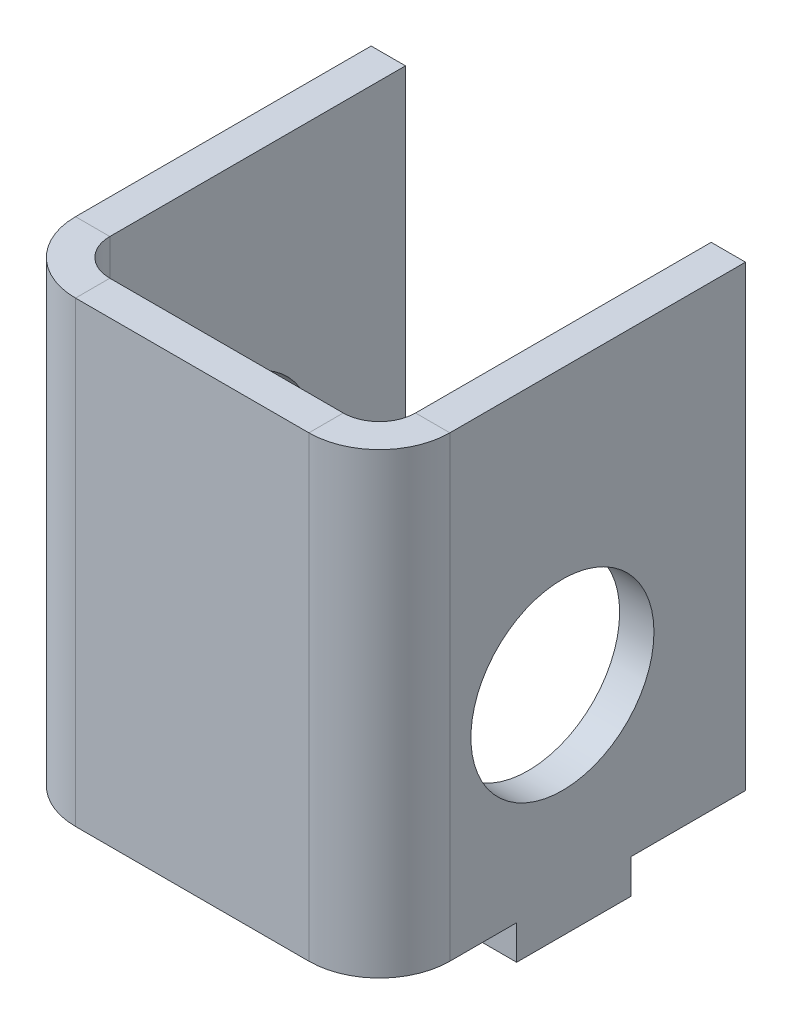
ISO-10303-21;
HEADER;
FILE_DESCRIPTION(('STEP AP214'),'2;1');
FILE_NAME('part.step','',(''),(''),'','','');
FILE_SCHEMA(('AUTOMOTIVE_DESIGN { 1 0 10303 214 1 1 1 1 }'));
ENDSEC;
DATA;
#1=APPLICATION_CONTEXT('core data for automotive mechanical design processes');
#2=APPLICATION_PROTOCOL_DEFINITION('international standard','automotive_design',2000,#1);
#3=PRODUCT_CONTEXT('',#1,'mechanical');
#4=PRODUCT('Part','Part','',(#3));
#5=PRODUCT_RELATED_PRODUCT_CATEGORY('part','',(#4));
#6=PRODUCT_DEFINITION_FORMATION('','',#4);
#7=PRODUCT_DEFINITION_CONTEXT('part definition',#1,'design');
#8=PRODUCT_DEFINITION('design','',#6,#7);
#9=PRODUCT_DEFINITION_SHAPE('','',#8);
#10=(LENGTH_UNIT() NAMED_UNIT(*) SI_UNIT(.MILLI.,.METRE.));
#11=(NAMED_UNIT(*) PLANE_ANGLE_UNIT() SI_UNIT($,.RADIAN.));
#12=(NAMED_UNIT(*) SI_UNIT($,.STERADIAN.) SOLID_ANGLE_UNIT());
#13=UNCERTAINTY_MEASURE_WITH_UNIT(LENGTH_MEASURE(1.E-05),#10,'distance_accuracy_value','');
#14=(GEOMETRIC_REPRESENTATION_CONTEXT(3) GLOBAL_UNCERTAINTY_ASSIGNED_CONTEXT((#13)) GLOBAL_UNIT_ASSIGNED_CONTEXT((#10,
#11,#12)) REPRESENTATION_CONTEXT('',''));
#15=CARTESIAN_POINT('',(0.,0.,0.));
#16=DIRECTION('',(0.,0.,1.));
#17=DIRECTION('',(1.,0.,0.));
#18=AXIS2_PLACEMENT_3D('',#15,#16,#17);
#19=CARTESIAN_POINT('',(449.389499999999,811.2125,16.4084000000001));
#20=DIRECTION('',(0.,-1.,0.));
#21=DIRECTION('',(0.,0.,-1.));
#22=AXIS2_PLACEMENT_3D('',#19,#20,#21);
#23=PLANE('',#22);
#24=DIRECTION('',(0.,0.,1.));
#25=VECTOR('',#24,1.);
#26=CARTESIAN_POINT('',(432.5239,811.2125,1.11022302462516E-13));
#27=LINE('',#26,#25);
#28=CARTESIAN_POINT('',(432.5239,811.2125,12.7000000000001));
#29=VERTEX_POINT('',#28);
#30=CARTESIAN_POINT('',(432.5239,811.2125,16.4084000000001));
#31=VERTEX_POINT('',#30);
#32=EDGE_CURVE('E66',#29,#31,#27,.T.);
#33=ORIENTED_EDGE('',*,*,#32,.F.);
#34=DIRECTION('',(-1.,0.,0.));
#35=VECTOR('',#34,1.);
#36=CARTESIAN_POINT('',(434.4289,811.2125,12.7000000000001));
#37=LINE('',#36,#35);
#38=CARTESIAN_POINT('',(434.4289,811.2125,12.7000000000001));
#39=VERTEX_POINT('',#38);
#40=EDGE_CURVE('E205',#39,#29,#37,.T.);
#41=ORIENTED_EDGE('',*,*,#40,.F.);
#42=DIRECTION('',(0.,0.,1.));
#43=VECTOR('',#42,1.);
#44=CARTESIAN_POINT('',(434.4289,811.2125,1.11022302462516E-13));
#45=LINE('',#44,#43);
#46=CARTESIAN_POINT('',(434.4289,811.2125,16.4084000000001));
#47=VERTEX_POINT('',#46);
#48=EDGE_CURVE('E189',#39,#47,#45,.T.);
#49=ORIENTED_EDGE('',*,*,#48,.T.);
#50=DIRECTION('',(-1.,0.,0.));
#51=VECTOR('',#50,1.);
#52=CARTESIAN_POINT('',(434.4289,811.2125,16.4084000000001));
#53=LINE('',#52,#51);
#54=EDGE_CURVE('E59',#47,#31,#53,.T.);
#55=ORIENTED_EDGE('',*,*,#54,.T.);
#56=EDGE_LOOP('',(#33,#41,#49,#55));
#57=FACE_BOUND('',#56,.T.);
#58=ADVANCED_FACE('F49',(#57),#23,.T.);
#59=CARTESIAN_POINT('',(434.4289,811.2125,1.11022302462516E-13));
#60=VERTEX_POINT('',#59);
#61=CARTESIAN_POINT('',(434.4289,811.2125,6.35000000000011));
#62=VERTEX_POINT('',#61);
#63=EDGE_CURVE('E201',#60,#62,#45,.T.);
#64=ORIENTED_EDGE('',*,*,#63,.T.);
#65=DIRECTION('',(1.,0.,0.));
#66=VECTOR('',#65,1.);
#67=CARTESIAN_POINT('',(434.4289,811.2125,6.35000000000011));
#68=LINE('',#67,#66);
#69=CARTESIAN_POINT('',(432.5239,811.2125,6.35000000000011));
#70=VERTEX_POINT('',#69);
#71=EDGE_CURVE('E74',#70,#62,#68,.T.);
#72=ORIENTED_EDGE('',*,*,#71,.F.);
#73=CARTESIAN_POINT('',(432.5239,811.2125,1.11022302462516E-13));
#74=VERTEX_POINT('',#73);
#75=EDGE_CURVE('E309',#74,#70,#27,.T.);
#76=ORIENTED_EDGE('',*,*,#75,.F.);
#77=DIRECTION('',(-1.,0.,0.));
#78=VECTOR('',#77,1.);
#79=CARTESIAN_POINT('',(434.4289,811.2125,1.11022302462516E-13));
#80=LINE('',#79,#78);
#81=EDGE_CURVE('E202',#60,#74,#80,.T.);
#82=ORIENTED_EDGE('',*,*,#81,.F.);
#83=EDGE_LOOP('',(#64,#72,#76,#82));
#84=FACE_BOUND('',#83,.T.);
#85=ADVANCED_FACE('F638',(#84),#23,.T.);
#86=CARTESIAN_POINT('',(449.389499999999,811.2125,18.4150000000001));
#87=DIRECTION('',(0.,-1.,0.));
#88=DIRECTION('',(0.,0.,-1.));
#89=AXIS2_PLACEMENT_3D('',#86,#87,#88);
#90=PLANE('',#89);
#91=DIRECTION('',(0.,0.,-1.));
#92=VECTOR('',#91,1.);
#93=CARTESIAN_POINT('',(453.301099999999,811.2125,20.3200000000001));
#94=LINE('',#93,#92);
#95=CARTESIAN_POINT('',(453.301099999999,811.2125,6.35000000000011));
#96=VERTEX_POINT('',#95);
#97=CARTESIAN_POINT('',(453.301099999999,811.2125,1.11022302462516E-13));
#98=VERTEX_POINT('',#97);
#99=EDGE_CURVE('E292',#96,#98,#94,.T.);
#100=ORIENTED_EDGE('',*,*,#99,.F.);
#101=DIRECTION('',(1.,0.,0.));
#102=VECTOR('',#101,1.);
#103=CARTESIAN_POINT('',(451.396099999999,811.2125,6.35000000000011));
#104=LINE('',#103,#102);
#105=CARTESIAN_POINT('',(451.396099999999,811.2125,6.35000000000011));
#106=VERTEX_POINT('',#105);
#107=EDGE_CURVE('E209',#106,#96,#104,.T.);
#108=ORIENTED_EDGE('',*,*,#107,.F.);
#109=DIRECTION('',(0.,0.,-1.));
#110=VECTOR('',#109,1.);
#111=CARTESIAN_POINT('',(451.396099999999,811.2125,20.3200000000001));
#112=LINE('',#111,#110);
#113=CARTESIAN_POINT('',(451.396099999999,811.2125,1.11022302462516E-13));
#114=VERTEX_POINT('',#113);
#115=EDGE_CURVE('E288',#106,#114,#112,.T.);
#116=ORIENTED_EDGE('',*,*,#115,.T.);
#117=DIRECTION('',(-1.,0.,0.));
#118=VECTOR('',#117,1.);
#119=CARTESIAN_POINT('',(453.301099999999,811.2125,1.11022302462516E-13));
#120=LINE('',#119,#118);
#121=EDGE_CURVE('E287',#98,#114,#120,.T.);
#122=ORIENTED_EDGE('',*,*,#121,.F.);
#123=EDGE_LOOP('',(#100,#108,#116,#122));
#124=FACE_BOUND('',#123,.T.);
#125=ADVANCED_FACE('F494',(#124),#90,.T.);
#126=CARTESIAN_POINT('',(451.396099999999,811.2125,16.4084000000001));
#127=VERTEX_POINT('',#126);
#128=CARTESIAN_POINT('',(451.396099999999,811.2125,12.7000000000001));
#129=VERTEX_POINT('',#128);
#130=EDGE_CURVE('E283',#127,#129,#112,.T.);
#131=ORIENTED_EDGE('',*,*,#130,.T.);
#132=DIRECTION('',(-1.,0.,0.));
#133=VECTOR('',#132,1.);
#134=CARTESIAN_POINT('',(451.396099999999,811.2125,12.7000000000001));
#135=LINE('',#134,#133);
#136=CARTESIAN_POINT('',(453.301099999999,811.2125,12.7000000000001));
#137=VERTEX_POINT('',#136);
#138=EDGE_CURVE('E243',#137,#129,#135,.T.);
#139=ORIENTED_EDGE('',*,*,#138,.F.);
#140=CARTESIAN_POINT('',(453.301099999999,811.2125,16.4084000000001));
#141=VERTEX_POINT('',#140);
#142=EDGE_CURVE('E293',#141,#137,#94,.T.);
#143=ORIENTED_EDGE('',*,*,#142,.F.);
#144=DIRECTION('',(-1.,0.,0.));
#145=VECTOR('',#144,1.);
#146=CARTESIAN_POINT('',(453.301099999999,811.2125,16.4084000000001));
#147=LINE('',#146,#145);
#148=EDGE_CURVE('E425',#141,#127,#147,.T.);
#149=ORIENTED_EDGE('',*,*,#148,.T.);
#150=EDGE_LOOP('',(#131,#139,#143,#149));
#151=FACE_BOUND('',#150,.T.);
#152=ADVANCED_FACE('F472',(#151),#90,.T.);
#153=CARTESIAN_POINT('',(436.4355,811.2125,20.3200000000001));
#154=DIRECTION('',(0.,-1.,0.));
#155=DIRECTION('',(0.,0.,-1.));
#156=AXIS2_PLACEMENT_3D('',#153,#154,#155);
#157=PLANE('',#156);
#158=DIRECTION('',(0.,0.,-1.));
#159=VECTOR('',#158,1.);
#160=CARTESIAN_POINT('',(436.4355,811.2125,20.3200000000001));
#161=LINE('',#160,#159);
#162=CARTESIAN_POINT('',(436.4355,811.2125,20.3200000000001));
#163=VERTEX_POINT('',#162);
#164=CARTESIAN_POINT('',(436.4355,811.2125,18.4150000000001));
#165=VERTEX_POINT('',#164);
#166=EDGE_CURVE('E11',#163,#165,#161,.T.);
#167=ORIENTED_EDGE('',*,*,#166,.F.);
#168=CARTESIAN_POINT('',(436.4355,811.2125,16.4084000000001));
#169=DIRECTION('',(0.,-1.,0.));
#170=DIRECTION('',(0.,0.,-1.));
#171=AXIS2_PLACEMENT_3D('',#168,#169,#170);
#172=CIRCLE('',#171,3.9116);
#173=EDGE_CURVE('E305',#31,#163,#172,.F.);
#174=ORIENTED_EDGE('',*,*,#173,.F.);
#175=ORIENTED_EDGE('',*,*,#54,.F.);
#176=CARTESIAN_POINT('',(436.4355,811.2125,16.4084000000001));
#177=DIRECTION('',(0.,-1.,0.));
#178=DIRECTION('',(1.,0.,0.));
#179=AXIS2_PLACEMENT_3D('',#176,#177,#178);
#180=CIRCLE('',#179,2.0066);
#181=EDGE_CURVE('E316',#47,#165,#180,.F.);
#182=ORIENTED_EDGE('',*,*,#181,.T.);
#183=EDGE_LOOP('',(#167,#174,#175,#182));
#184=FACE_BOUND('',#183,.T.);
#185=ADVANCED_FACE('F51',(#184),#157,.T.);
#186=CARTESIAN_POINT('',(434.4289,811.2125,16.4084000000001));
#187=DIRECTION('',(0.,-1.,0.));
#188=DIRECTION('',(0.,0.,-1.));
#189=AXIS2_PLACEMENT_3D('',#186,#187,#188);
#190=PLANE('',#189);
#191=DIRECTION('',(1.,0.,0.));
#192=VECTOR('',#191,1.);
#193=CARTESIAN_POINT('',(432.5239,811.2125,20.3200000000001));
#194=LINE('',#193,#192);
#195=CARTESIAN_POINT('',(449.389499999999,811.2125,20.3200000000001));
#196=VERTEX_POINT('',#195);
#197=EDGE_CURVE('E301',#163,#196,#194,.T.);
#198=ORIENTED_EDGE('',*,*,#197,.F.);
#199=ORIENTED_EDGE('',*,*,#166,.T.);
#200=DIRECTION('',(1.,0.,0.));
#201=VECTOR('',#200,1.);
#202=CARTESIAN_POINT('',(432.5239,811.2125,18.4150000000001));
#203=LINE('',#202,#201);
#204=CARTESIAN_POINT('',(449.389499999999,811.2125,18.4150000000001));
#205=VERTEX_POINT('',#204);
#206=EDGE_CURVE('E320',#165,#205,#203,.T.);
#207=ORIENTED_EDGE('',*,*,#206,.T.);
#208=DIRECTION('',(0.,0.,1.));
#209=VECTOR('',#208,1.);
#210=CARTESIAN_POINT('',(449.389499999999,811.2125,18.4150000000001));
#211=LINE('',#210,#209);
#212=EDGE_CURVE('E422',#205,#196,#211,.T.);
#213=ORIENTED_EDGE('',*,*,#212,.T.);
#214=EDGE_LOOP('',(#198,#199,#207,#213));
#215=FACE_BOUND('',#214,.T.);
#216=ADVANCED_FACE('F452',(#215),#190,.T.);
#217=CARTESIAN_POINT('',(432.5239,836.6125,16.4084000000001));
#218=DIRECTION('',(0.,1.,0.));
#219=DIRECTION('',(0.,0.,1.));
#220=AXIS2_PLACEMENT_3D('',#217,#218,#219);
#221=PLANE('',#220);
#222=DIRECTION('',(1.,0.,0.));
#223=VECTOR('',#222,1.);
#224=CARTESIAN_POINT('',(432.5239,836.6125,16.4084000000001));
#225=LINE('',#224,#223);
#226=CARTESIAN_POINT('',(432.5239,836.6125,16.4084000000001));
#227=VERTEX_POINT('',#226);
#228=CARTESIAN_POINT('',(434.4289,836.6125,16.4084000000001));
#229=VERTEX_POINT('',#228);
#230=EDGE_CURVE('E431',#227,#229,#225,.T.);
#231=ORIENTED_EDGE('',*,*,#230,.F.);
#232=CARTESIAN_POINT('',(436.4355,836.6125,16.4084000000001));
#233=DIRECTION('',(0.,-1.,0.));
#234=DIRECTION('',(0.,0.,-1.));
#235=AXIS2_PLACEMENT_3D('',#232,#233,#234);
#236=CIRCLE('',#235,3.9116);
#237=CARTESIAN_POINT('',(436.4355,836.6125,20.3200000000001));
#238=VERTEX_POINT('',#237);
#239=EDGE_CURVE('E348',#227,#238,#236,.F.);
#240=ORIENTED_EDGE('',*,*,#239,.T.);
#241=DIRECTION('',(0.,0.,1.));
#242=VECTOR('',#241,1.);
#243=CARTESIAN_POINT('',(436.4355,836.6125,18.4150000000001));
#244=LINE('',#243,#242);
#245=CARTESIAN_POINT('',(436.4355,836.6125,18.4150000000001));
#246=VERTEX_POINT('',#245);
#247=EDGE_CURVE('E428',#246,#238,#244,.T.);
#248=ORIENTED_EDGE('',*,*,#247,.F.);
#249=CARTESIAN_POINT('',(436.4355,836.6125,16.4084000000001));
#250=DIRECTION('',(0.,-1.,0.));
#251=DIRECTION('',(1.,0.,0.));
#252=AXIS2_PLACEMENT_3D('',#249,#250,#251);
#253=CIRCLE('',#252,2.0066);
#254=EDGE_CURVE('E363',#229,#246,#253,.F.);
#255=ORIENTED_EDGE('',*,*,#254,.F.);
#256=EDGE_LOOP('',(#231,#240,#248,#255));
#257=FACE_BOUND('',#256,.T.);
#258=ADVANCED_FACE('F716',(#257),#221,.T.);
#259=CARTESIAN_POINT('',(436.4355,836.6125,18.4150000000001));
#260=DIRECTION('',(0.,1.,0.));
#261=DIRECTION('',(0.,0.,1.));
#262=AXIS2_PLACEMENT_3D('',#259,#260,#261);
#263=PLANE('',#262);
#264=DIRECTION('',(0.,0.,1.));
#265=VECTOR('',#264,1.);
#266=CARTESIAN_POINT('',(432.5239,836.6125,1.11022302462516E-13));
#267=LINE('',#266,#265);
#268=CARTESIAN_POINT('',(432.5239,836.6125,1.11022302462516E-13));
#269=VERTEX_POINT('',#268);
#270=EDGE_CURVE('E352',#269,#227,#267,.T.);
#271=ORIENTED_EDGE('',*,*,#270,.T.);
#272=ORIENTED_EDGE('',*,*,#230,.T.);
#273=DIRECTION('',(0.,0.,1.));
#274=VECTOR('',#273,1.);
#275=CARTESIAN_POINT('',(434.4289,836.6125,1.11022302462516E-13));
#276=LINE('',#275,#274);
#277=CARTESIAN_POINT('',(434.4289,836.6125,1.11022302462516E-13));
#278=VERTEX_POINT('',#277);
#279=EDGE_CURVE('E360',#278,#229,#276,.T.);
#280=ORIENTED_EDGE('',*,*,#279,.F.);
#281=DIRECTION('',(-1.,0.,0.));
#282=VECTOR('',#281,1.);
#283=CARTESIAN_POINT('',(434.4289,836.6125,1.11022302462516E-13));
#284=LINE('',#283,#282);
#285=EDGE_CURVE('E356',#278,#269,#284,.T.);
#286=ORIENTED_EDGE('',*,*,#285,.T.);
#287=EDGE_LOOP('',(#271,#272,#280,#286));
#288=FACE_BOUND('',#287,.T.);
#289=ADVANCED_FACE('F713',(#288),#263,.T.);
#290=CARTESIAN_POINT('',(453.301099999999,811.2125,16.4084000000001));
#291=DIRECTION('',(0.,-1.,0.));
#292=DIRECTION('',(0.,0.,-1.));
#293=AXIS2_PLACEMENT_3D('',#290,#291,#292);
#294=PLANE('',#293);
#295=ORIENTED_EDGE('',*,*,#148,.F.);
#296=CARTESIAN_POINT('',(449.389499999999,811.2125,16.4084000000001));
#297=DIRECTION('',(0.,-1.,0.));
#298=DIRECTION('',(0.,0.,-1.));
#299=AXIS2_PLACEMENT_3D('',#296,#297,#298);
#300=CIRCLE('',#299,3.9116);
#301=EDGE_CURVE('E297',#196,#141,#300,.F.);
#302=ORIENTED_EDGE('',*,*,#301,.F.);
#303=ORIENTED_EDGE('',*,*,#212,.F.);
#304=CARTESIAN_POINT('',(449.389499999999,811.2125,16.4084000000001));
#305=DIRECTION('',(0.,-1.,0.));
#306=DIRECTION('',(1.,0.,0.));
#307=AXIS2_PLACEMENT_3D('',#304,#305,#306);
#308=CIRCLE('',#307,2.0066);
#309=EDGE_CURVE('E324',#205,#127,#308,.F.);
#310=ORIENTED_EDGE('',*,*,#309,.T.);
#311=EDGE_LOOP('',(#295,#302,#303,#310));
#312=FACE_BOUND('',#311,.T.);
#313=ADVANCED_FACE('F461',(#312),#294,.T.);
#314=CARTESIAN_POINT('',(449.389499999999,836.6125,20.3200000000001));
#315=DIRECTION('',(0.,1.,0.));
#316=DIRECTION('',(0.,0.,1.));
#317=AXIS2_PLACEMENT_3D('',#314,#315,#316);
#318=PLANE('',#317);
#319=DIRECTION('',(0.,0.,-1.));
#320=VECTOR('',#319,1.);
#321=CARTESIAN_POINT('',(449.389499999999,836.6125,20.3200000000001));
#322=LINE('',#321,#320);
#323=CARTESIAN_POINT('',(449.389499999999,836.6125,20.3200000000001));
#324=VERTEX_POINT('',#323);
#325=CARTESIAN_POINT('',(449.389499999999,836.6125,18.4150000000001));
#326=VERTEX_POINT('',#325);
#327=EDGE_CURVE('E419',#324,#326,#322,.T.);
#328=ORIENTED_EDGE('',*,*,#327,.F.);
#329=CARTESIAN_POINT('',(449.389499999999,836.6125,16.4084000000001));
#330=DIRECTION('',(0.,-1.,0.));
#331=DIRECTION('',(0.,0.,-1.));
#332=AXIS2_PLACEMENT_3D('',#329,#330,#331);
#333=CIRCLE('',#332,3.9116);
#334=CARTESIAN_POINT('',(453.301099999999,836.6125,16.4084000000001));
#335=VERTEX_POINT('',#334);
#336=EDGE_CURVE('E340',#324,#335,#333,.F.);
#337=ORIENTED_EDGE('',*,*,#336,.T.);
#338=DIRECTION('',(1.,0.,0.));
#339=VECTOR('',#338,1.);
#340=CARTESIAN_POINT('',(451.396099999999,836.6125,16.4084000000001));
#341=LINE('',#340,#339);
#342=CARTESIAN_POINT('',(451.396099999999,836.6125,16.4084000000001));
#343=VERTEX_POINT('',#342);
#344=EDGE_CURVE('E416',#343,#335,#341,.T.);
#345=ORIENTED_EDGE('',*,*,#344,.F.);
#346=CARTESIAN_POINT('',(449.389499999999,836.6125,16.4084000000001));
#347=DIRECTION('',(0.,-1.,0.));
#348=DIRECTION('',(1.,0.,0.));
#349=AXIS2_PLACEMENT_3D('',#346,#347,#348);
#350=CIRCLE('',#349,2.0066);
#351=EDGE_CURVE('E371',#326,#343,#350,.F.);
#352=ORIENTED_EDGE('',*,*,#351,.F.);
#353=EDGE_LOOP('',(#328,#337,#345,#352));
#354=FACE_BOUND('',#353,.T.);
#355=ADVANCED_FACE('F704',(#354),#318,.T.);
#356=CARTESIAN_POINT('',(451.396099999999,836.6125,16.4084000000001));
#357=DIRECTION('',(0.,1.,0.));
#358=DIRECTION('',(0.,0.,1.));
#359=AXIS2_PLACEMENT_3D('',#356,#357,#358);
#360=PLANE('',#359);
#361=DIRECTION('',(1.,0.,0.));
#362=VECTOR('',#361,1.);
#363=CARTESIAN_POINT('',(432.5239,836.6125,20.3200000000001));
#364=LINE('',#363,#362);
#365=EDGE_CURVE('E344',#238,#324,#364,.T.);
#366=ORIENTED_EDGE('',*,*,#365,.T.);
#367=ORIENTED_EDGE('',*,*,#327,.T.);
#368=DIRECTION('',(1.,0.,0.));
#369=VECTOR('',#368,1.);
#370=CARTESIAN_POINT('',(432.5239,836.6125,18.4150000000001));
#371=LINE('',#370,#369);
#372=EDGE_CURVE('E367',#246,#326,#371,.T.);
#373=ORIENTED_EDGE('',*,*,#372,.F.);
#374=ORIENTED_EDGE('',*,*,#247,.T.);
#375=EDGE_LOOP('',(#366,#367,#373,#374));
#376=FACE_BOUND('',#375,.T.);
#377=ADVANCED_FACE('F700',(#376),#360,.T.);
#378=CARTESIAN_POINT('',(451.396099999999,811.2125,20.3200000000001));
#379=DIRECTION('',(1.,0.,0.));
#380=DIRECTION('',(0.,0.,-1.));
#381=AXIS2_PLACEMENT_3D('',#378,#379,#380);
#382=PLANE('',#381);
#383=CARTESIAN_POINT('',(451.396099999999,821.3725,10.1599999999925));
#384=DIRECTION('',(1.,0.,0.));
#385=DIRECTION('',(0.,0.,-1.));
#386=AXIS2_PLACEMENT_3D('',#383,#384,#385);
#387=CIRCLE('',#386,5.08000000000002);
#388=CARTESIAN_POINT('',(451.396099999999,821.3725,5.07999999999253));
#389=VERTEX_POINT('',#388);
#390=EDGE_CURVE('E278',#389,#389,#387,.T.);
#391=ORIENTED_EDGE('',*,*,#390,.T.);
#392=EDGE_LOOP('',(#391));
#393=FACE_BOUND('',#392,.T.);
#394=DIRECTION('',(0.,0.,-1.));
#395=VECTOR('',#394,1.);
#396=CARTESIAN_POINT('',(451.396099999999,836.6125,20.3200000000001));
#397=LINE('',#396,#395);
#398=CARTESIAN_POINT('',(451.396099999999,836.6125,1.11022302462516E-13));
#399=VERTEX_POINT('',#398);
#400=EDGE_CURVE('E282',#343,#399,#397,.T.);
#401=ORIENTED_EDGE('',*,*,#400,.T.);
#402=DIRECTION('',(0.,1.,0.));
#403=VECTOR('',#402,1.);
#404=CARTESIAN_POINT('',(451.396099999999,811.2125,1.11022302462516E-13));
#405=LINE('',#404,#403);
#406=EDGE_CURVE('E413',#114,#399,#405,.T.);
#407=ORIENTED_EDGE('',*,*,#406,.F.);
#408=ORIENTED_EDGE('',*,*,#115,.F.);
#409=DIRECTION('',(0.,1.,0.));
#410=VECTOR('',#409,1.);
#411=CARTESIAN_POINT('',(451.396099999999,809.3075,6.35000000000011));
#412=LINE('',#411,#410);
#413=CARTESIAN_POINT('',(451.396099999999,809.3075,6.35000000000011));
#414=VERTEX_POINT('',#413);
#415=EDGE_CURVE('E267',#414,#106,#412,.T.);
#416=ORIENTED_EDGE('',*,*,#415,.F.);
#417=DIRECTION('',(0.,0.,-1.));
#418=VECTOR('',#417,1.);
#419=CARTESIAN_POINT('',(451.396099999999,809.3075,12.7000000000001));
#420=LINE('',#419,#418);
#421=CARTESIAN_POINT('',(451.396099999999,809.3075,12.7000000000001));
#422=VERTEX_POINT('',#421);
#423=EDGE_CURVE('E238',#422,#414,#420,.T.);
#424=ORIENTED_EDGE('',*,*,#423,.F.);
#425=DIRECTION('',(0.,1.,0.));
#426=VECTOR('',#425,1.);
#427=CARTESIAN_POINT('',(451.396099999999,809.3075,12.7000000000001));
#428=LINE('',#427,#426);
#429=EDGE_CURVE('E252',#422,#129,#428,.T.);
#430=ORIENTED_EDGE('',*,*,#429,.T.);
#431=ORIENTED_EDGE('',*,*,#130,.F.);
#432=DIRECTION('',(0.,1.,0.));
#433=VECTOR('',#432,1.);
#434=CARTESIAN_POINT('',(451.396099999999,811.2125,16.4084000000001));
#435=LINE('',#434,#433);
#436=EDGE_CURVE('E328',#127,#343,#435,.T.);
#437=ORIENTED_EDGE('',*,*,#436,.T.);
#438=EDGE_LOOP('',(#401,#407,#408,#416,#424,#430,#431,#437));
#439=FACE_BOUND('',#438,.T.);
#440=ADVANCED_FACE('F480',(#393,#439),#382,.F.);
#441=CARTESIAN_POINT('',(453.301099999999,811.2125,1.11022302462516E-13));
#442=DIRECTION('',(0.,0.,-1.));
#443=DIRECTION('',(0.,1.,0.));
#444=AXIS2_PLACEMENT_3D('',#441,#442,#443);
#445=PLANE('',#444);
#446=DIRECTION('',(-1.,0.,0.));
#447=VECTOR('',#446,1.);
#448=CARTESIAN_POINT('',(453.301099999999,836.6125,1.11022302462516E-13));
#449=LINE('',#448,#447);
#450=CARTESIAN_POINT('',(453.301099999999,836.6125,1.11022302462516E-13));
#451=VERTEX_POINT('',#450);
#452=EDGE_CURVE('E332',#451,#399,#449,.T.);
#453=ORIENTED_EDGE('',*,*,#452,.F.);
#454=DIRECTION('',(0.,1.,0.));
#455=VECTOR('',#454,1.);
#456=CARTESIAN_POINT('',(453.301099999999,811.2125,1.11022302462516E-13));
#457=LINE('',#456,#455);
#458=EDGE_CURVE('E410',#98,#451,#457,.T.);
#459=ORIENTED_EDGE('',*,*,#458,.F.);
#460=ORIENTED_EDGE('',*,*,#121,.T.);
#461=ORIENTED_EDGE('',*,*,#406,.T.);
#462=EDGE_LOOP('',(#453,#459,#460,#461));
#463=FACE_BOUND('',#462,.T.);
#464=ADVANCED_FACE('F693',(#463),#445,.T.);
#465=CARTESIAN_POINT('',(453.301099999999,811.2125,20.3200000000001));
#466=DIRECTION('',(1.,0.,0.));
#467=DIRECTION('',(0.,0.,-1.));
#468=AXIS2_PLACEMENT_3D('',#465,#466,#467);
#469=PLANE('',#468);
#470=CARTESIAN_POINT('',(453.301099999999,821.3725,10.1599999999926));
#471=DIRECTION('',(1.,0.,0.));
#472=DIRECTION('',(0.,0.,-1.));
#473=AXIS2_PLACEMENT_3D('',#470,#471,#472);
#474=CIRCLE('',#473,5.08000000000002);
#475=CARTESIAN_POINT('',(453.301099999999,821.3725,5.07999999999255));
#476=VERTEX_POINT('',#475);
#477=EDGE_CURVE('E270',#476,#476,#474,.T.);
#478=ORIENTED_EDGE('',*,*,#477,.F.);
#479=EDGE_LOOP('',(#478));
#480=FACE_BOUND('',#479,.T.);
#481=DIRECTION('',(0.,0.,-1.));
#482=VECTOR('',#481,1.);
#483=CARTESIAN_POINT('',(453.301099999999,836.6125,20.3200000000001));
#484=LINE('',#483,#482);
#485=EDGE_CURVE('E336',#335,#451,#484,.T.);
#486=ORIENTED_EDGE('',*,*,#485,.F.);
#487=DIRECTION('',(0.,1.,0.));
#488=VECTOR('',#487,1.);
#489=CARTESIAN_POINT('',(453.301099999999,811.2125,16.4084000000001));
#490=LINE('',#489,#488);
#491=EDGE_CURVE('E406',#141,#335,#490,.T.);
#492=ORIENTED_EDGE('',*,*,#491,.F.);
#493=ORIENTED_EDGE('',*,*,#142,.T.);
#494=DIRECTION('',(0.,1.,0.));
#495=VECTOR('',#494,1.);
#496=CARTESIAN_POINT('',(453.301099999999,809.3075,12.7000000000001));
#497=LINE('',#496,#495);
#498=CARTESIAN_POINT('',(453.301099999999,809.3075,12.7000000000001));
#499=VERTEX_POINT('',#498);
#500=EDGE_CURVE('E261',#499,#137,#497,.T.);
#501=ORIENTED_EDGE('',*,*,#500,.F.);
#502=DIRECTION('',(0.,0.,1.));
#503=VECTOR('',#502,1.);
#504=CARTESIAN_POINT('',(453.301099999999,809.3075,12.7000000000001));
#505=LINE('',#504,#503);
#506=CARTESIAN_POINT('',(453.301099999999,809.3075,6.35000000000011));
#507=VERTEX_POINT('',#506);
#508=EDGE_CURVE('E246',#507,#499,#505,.T.);
#509=ORIENTED_EDGE('',*,*,#508,.F.);
#510=DIRECTION('',(0.,1.,0.));
#511=VECTOR('',#510,1.);
#512=CARTESIAN_POINT('',(453.301099999999,809.3075,6.35000000000011));
#513=LINE('',#512,#511);
#514=EDGE_CURVE('E264',#507,#96,#513,.T.);
#515=ORIENTED_EDGE('',*,*,#514,.T.);
#516=ORIENTED_EDGE('',*,*,#99,.T.);
#517=ORIENTED_EDGE('',*,*,#458,.T.);
#518=EDGE_LOOP('',(#486,#492,#493,#501,#509,#515,#516,#517));
#519=FACE_BOUND('',#518,.T.);
#520=ADVANCED_FACE('F469',(#480,#519),#469,.T.);
#521=CARTESIAN_POINT('',(449.389499999999,811.2125,16.4084000000001));
#522=DIRECTION('',(0.,1.,0.));
#523=DIRECTION('',(0.,0.,1.));
#524=AXIS2_PLACEMENT_3D('',#521,#522,#523);
#525=CYLINDRICAL_SURFACE('',#524,3.9116);
#526=ORIENTED_EDGE('',*,*,#336,.F.);
#527=DIRECTION('',(0.,1.,0.));
#528=VECTOR('',#527,1.);
#529=CARTESIAN_POINT('',(449.389499999999,811.2125,20.3200000000001));
#530=LINE('',#529,#528);
#531=EDGE_CURVE('E402',#196,#324,#530,.T.);
#532=ORIENTED_EDGE('',*,*,#531,.F.);
#533=ORIENTED_EDGE('',*,*,#301,.T.);
#534=ORIENTED_EDGE('',*,*,#491,.T.);
#535=EDGE_LOOP('',(#526,#532,#533,#534));
#536=FACE_BOUND('',#535,.T.);
#537=ADVANCED_FACE('F460',(#536),#525,.T.);
#538=CARTESIAN_POINT('',(432.5239,811.2125,20.3200000000001));
#539=DIRECTION('',(0.,0.,1.));
#540=DIRECTION('',(0.,-1.,0.));
#541=AXIS2_PLACEMENT_3D('',#538,#539,#540);
#542=PLANE('',#541);
#543=ORIENTED_EDGE('',*,*,#365,.F.);
#544=DIRECTION('',(0.,1.,0.));
#545=VECTOR('',#544,1.);
#546=CARTESIAN_POINT('',(436.4355,811.2125,20.3200000000001));
#547=LINE('',#546,#545);
#548=EDGE_CURVE('E398',#163,#238,#547,.T.);
#549=ORIENTED_EDGE('',*,*,#548,.F.);
#550=ORIENTED_EDGE('',*,*,#197,.T.);
#551=ORIENTED_EDGE('',*,*,#531,.T.);
#552=EDGE_LOOP('',(#543,#549,#550,#551));
#553=FACE_BOUND('',#552,.T.);
#554=ADVANCED_FACE('F451',(#553),#542,.T.);
#555=CARTESIAN_POINT('',(436.4355,811.2125,16.4084000000001));
#556=DIRECTION('',(0.,1.,0.));
#557=DIRECTION('',(0.,0.,1.));
#558=AXIS2_PLACEMENT_3D('',#555,#556,#557);
#559=CYLINDRICAL_SURFACE('',#558,3.9116);
#560=ORIENTED_EDGE('',*,*,#239,.F.);
#561=DIRECTION('',(0.,1.,0.));
#562=VECTOR('',#561,1.);
#563=CARTESIAN_POINT('',(432.5239,811.2125,16.4084000000001));
#564=LINE('',#563,#562);
#565=EDGE_CURVE('E394',#31,#227,#564,.T.);
#566=ORIENTED_EDGE('',*,*,#565,.F.);
#567=ORIENTED_EDGE('',*,*,#173,.T.);
#568=ORIENTED_EDGE('',*,*,#548,.T.);
#569=EDGE_LOOP('',(#560,#566,#567,#568));
#570=FACE_BOUND('',#569,.T.);
#571=ADVANCED_FACE('F442',(#570),#559,.T.);
#572=CARTESIAN_POINT('',(432.5239,811.2125,1.11022302462516E-13));
#573=DIRECTION('',(-1.,0.,0.));
#574=DIRECTION('',(0.,0.,1.));
#575=AXIS2_PLACEMENT_3D('',#572,#573,#574);
#576=PLANE('',#575);
#577=CARTESIAN_POINT('',(432.5239,821.3725,10.1599999999923));
#578=DIRECTION('',(1.,0.,0.));
#579=DIRECTION('',(0.,0.,-1.));
#580=AXIS2_PLACEMENT_3D('',#577,#578,#579);
#581=CIRCLE('',#580,5.08000000000002);
#582=CARTESIAN_POINT('',(432.5239,821.3725,5.07999999999227));
#583=VERTEX_POINT('',#582);
#584=EDGE_CURVE('E271',#583,#583,#581,.T.);
#585=ORIENTED_EDGE('',*,*,#584,.T.);
#586=EDGE_LOOP('',(#585));
#587=FACE_BOUND('',#586,.T.);
#588=ORIENTED_EDGE('',*,*,#270,.F.);
#589=DIRECTION('',(0.,1.,0.));
#590=VECTOR('',#589,1.);
#591=CARTESIAN_POINT('',(432.5239,811.2125,1.11022302462516E-13));
#592=LINE('',#591,#590);
#593=EDGE_CURVE('E391',#74,#269,#592,.T.);
#594=ORIENTED_EDGE('',*,*,#593,.F.);
#595=ORIENTED_EDGE('',*,*,#75,.T.);
#596=DIRECTION('',(0.,1.,0.));
#597=VECTOR('',#596,1.);
#598=CARTESIAN_POINT('',(432.5239,809.3075,6.35000000000011));
#599=LINE('',#598,#597);
#600=CARTESIAN_POINT('',(432.5239,809.3075,6.35000000000011));
#601=VERTEX_POINT('',#600);
#602=EDGE_CURVE('E225',#601,#70,#599,.T.);
#603=ORIENTED_EDGE('',*,*,#602,.F.);
#604=DIRECTION('',(0.,0.,-1.));
#605=VECTOR('',#604,1.);
#606=CARTESIAN_POINT('',(432.5239,809.3075,12.7000000000001));
#607=LINE('',#606,#605);
#608=CARTESIAN_POINT('',(432.5239,809.3075,12.7000000000001));
#609=VERTEX_POINT('',#608);
#610=EDGE_CURVE('E233',#609,#601,#607,.T.);
#611=ORIENTED_EDGE('',*,*,#610,.F.);
#612=DIRECTION('',(0.,1.,0.));
#613=VECTOR('',#612,1.);
#614=CARTESIAN_POINT('',(432.5239,809.3075,12.7000000000001));
#615=LINE('',#614,#613);
#616=EDGE_CURVE('E625',#609,#29,#615,.T.);
#617=ORIENTED_EDGE('',*,*,#616,.T.);
#618=ORIENTED_EDGE('',*,*,#32,.T.);
#619=ORIENTED_EDGE('',*,*,#565,.T.);
#620=EDGE_LOOP('',(#588,#594,#595,#603,#611,#617,#618,#619));
#621=FACE_BOUND('',#620,.T.);
#622=ADVANCED_FACE('F624',(#587,#621),#576,.T.);
#623=CARTESIAN_POINT('',(434.4289,811.2125,1.11022302462516E-13));
#624=DIRECTION('',(0.,0.,-1.));
#625=DIRECTION('',(0.,1.,0.));
#626=AXIS2_PLACEMENT_3D('',#623,#624,#625);
#627=PLANE('',#626);
#628=ORIENTED_EDGE('',*,*,#285,.F.);
#629=DIRECTION('',(0.,1.,0.));
#630=VECTOR('',#629,1.);
#631=CARTESIAN_POINT('',(434.4289,811.2125,1.11022302462516E-13));
#632=LINE('',#631,#630);
#633=EDGE_CURVE('E388',#60,#278,#632,.T.);
#634=ORIENTED_EDGE('',*,*,#633,.F.);
#635=ORIENTED_EDGE('',*,*,#81,.T.);
#636=ORIENTED_EDGE('',*,*,#593,.T.);
#637=EDGE_LOOP('',(#628,#634,#635,#636));
#638=FACE_BOUND('',#637,.T.);
#639=ADVANCED_FACE('F641',(#638),#627,.T.);
#640=CARTESIAN_POINT('',(434.4289,811.2125,1.11022302462516E-13));
#641=DIRECTION('',(-1.,0.,0.));
#642=DIRECTION('',(0.,0.,1.));
#643=AXIS2_PLACEMENT_3D('',#640,#641,#642);
#644=PLANE('',#643);
#645=CARTESIAN_POINT('',(434.4289,821.3725,10.1599999999923));
#646=DIRECTION('',(-1.,0.,0.));
#647=DIRECTION('',(0.,0.,1.));
#648=AXIS2_PLACEMENT_3D('',#645,#646,#647);
#649=CIRCLE('',#648,5.08000000000002);
#650=CARTESIAN_POINT('',(434.4289,821.3725,15.2399999999923));
#651=VERTEX_POINT('',#650);
#652=EDGE_CURVE('E53',#651,#651,#649,.T.);
#653=ORIENTED_EDGE('',*,*,#652,.T.);
#654=EDGE_LOOP('',(#653));
#655=FACE_BOUND('',#654,.T.);
#656=ORIENTED_EDGE('',*,*,#279,.T.);
#657=DIRECTION('',(0.,1.,0.));
#658=VECTOR('',#657,1.);
#659=CARTESIAN_POINT('',(434.4289,811.2125,16.4084000000001));
#660=LINE('',#659,#658);
#661=EDGE_CURVE('E197',#47,#229,#660,.T.);
#662=ORIENTED_EDGE('',*,*,#661,.F.);
#663=ORIENTED_EDGE('',*,*,#48,.F.);
#664=DIRECTION('',(0.,1.,0.));
#665=VECTOR('',#664,1.);
#666=CARTESIAN_POINT('',(434.4289,809.3075,12.7000000000001));
#667=LINE('',#666,#665);
#668=CARTESIAN_POINT('',(434.4289,809.3075,12.7000000000001));
#669=VERTEX_POINT('',#668);
#670=EDGE_CURVE('E194',#669,#39,#667,.T.);
#671=ORIENTED_EDGE('',*,*,#670,.F.);
#672=DIRECTION('',(0.,0.,1.));
#673=VECTOR('',#672,1.);
#674=CARTESIAN_POINT('',(434.4289,809.3075,12.7000000000001));
#675=LINE('',#674,#673);
#676=CARTESIAN_POINT('',(434.4289,809.3075,6.35000000000011));
#677=VERTEX_POINT('',#676);
#678=EDGE_CURVE('E215',#677,#669,#675,.T.);
#679=ORIENTED_EDGE('',*,*,#678,.F.);
#680=DIRECTION('',(0.,1.,0.));
#681=VECTOR('',#680,1.);
#682=CARTESIAN_POINT('',(434.4289,809.3075,6.35000000000011));
#683=LINE('',#682,#681);
#684=EDGE_CURVE('E216',#677,#62,#683,.T.);
#685=ORIENTED_EDGE('',*,*,#684,.T.);
#686=ORIENTED_EDGE('',*,*,#63,.F.);
#687=ORIENTED_EDGE('',*,*,#633,.T.);
#688=EDGE_LOOP('',(#656,#662,#663,#671,#679,#685,#686,#687));
#689=FACE_BOUND('',#688,.T.);
#690=ADVANCED_FACE('F191',(#655,#689),#644,.F.);
#691=CARTESIAN_POINT('',(436.4355,811.2125,16.4084000000001));
#692=DIRECTION('',(0.,1.,0.));
#693=DIRECTION('',(0.,0.,1.));
#694=AXIS2_PLACEMENT_3D('',#691,#692,#693);
#695=CYLINDRICAL_SURFACE('',#694,2.0066);
#696=ORIENTED_EDGE('',*,*,#254,.T.);
#697=DIRECTION('',(0.,1.,0.));
#698=VECTOR('',#697,1.);
#699=CARTESIAN_POINT('',(436.4355,811.2125,18.4150000000001));
#700=LINE('',#699,#698);
#701=EDGE_CURVE('E382',#165,#246,#700,.T.);
#702=ORIENTED_EDGE('',*,*,#701,.F.);
#703=ORIENTED_EDGE('',*,*,#181,.F.);
#704=ORIENTED_EDGE('',*,*,#661,.T.);
#705=EDGE_LOOP('',(#696,#702,#703,#704));
#706=FACE_BOUND('',#705,.T.);
#707=ADVANCED_FACE('F672',(#706),#695,.F.);
#708=CARTESIAN_POINT('',(432.5239,811.2125,18.4150000000001));
#709=DIRECTION('',(0.,0.,1.));
#710=DIRECTION('',(0.,-1.,0.));
#711=AXIS2_PLACEMENT_3D('',#708,#709,#710);
#712=PLANE('',#711);
#713=ORIENTED_EDGE('',*,*,#372,.T.);
#714=DIRECTION('',(0.,1.,0.));
#715=VECTOR('',#714,1.);
#716=CARTESIAN_POINT('',(449.389499999999,811.2125,18.4150000000001));
#717=LINE('',#716,#715);
#718=EDGE_CURVE('E378',#205,#326,#717,.T.);
#719=ORIENTED_EDGE('',*,*,#718,.F.);
#720=ORIENTED_EDGE('',*,*,#206,.F.);
#721=ORIENTED_EDGE('',*,*,#701,.T.);
#722=EDGE_LOOP('',(#713,#719,#720,#721));
#723=FACE_BOUND('',#722,.T.);
#724=ADVANCED_FACE('F668',(#723),#712,.F.);
#725=CARTESIAN_POINT('',(449.389499999999,811.2125,16.4084000000001));
#726=DIRECTION('',(0.,1.,0.));
#727=DIRECTION('',(0.,0.,1.));
#728=AXIS2_PLACEMENT_3D('',#725,#726,#727);
#729=CYLINDRICAL_SURFACE('',#728,2.0066);
#730=ORIENTED_EDGE('',*,*,#351,.T.);
#731=ORIENTED_EDGE('',*,*,#436,.F.);
#732=ORIENTED_EDGE('',*,*,#309,.F.);
#733=ORIENTED_EDGE('',*,*,#718,.T.);
#734=EDGE_LOOP('',(#730,#731,#732,#733));
#735=FACE_BOUND('',#734,.T.);
#736=ADVANCED_FACE('F664',(#735),#729,.F.);
#737=CARTESIAN_POINT('',(449.389499999999,836.6125,16.4084000000001));
#738=DIRECTION('',(0.,-1.,0.));
#739=DIRECTION('',(0.,0.,-1.));
#740=AXIS2_PLACEMENT_3D('',#737,#738,#739);
#741=PLANE('',#740);
#742=ORIENTED_EDGE('',*,*,#400,.F.);
#743=ORIENTED_EDGE('',*,*,#344,.T.);
#744=ORIENTED_EDGE('',*,*,#485,.T.);
#745=ORIENTED_EDGE('',*,*,#452,.T.);
#746=EDGE_LOOP('',(#742,#743,#744,#745));
#747=FACE_BOUND('',#746,.T.);
#748=ADVANCED_FACE('F660',(#747),#741,.F.);
#749=CARTESIAN_POINT('',(432.5239,821.3725,10.1599999999923));
#750=DIRECTION('',(1.,0.,0.));
#751=DIRECTION('',(0.,0.,-1.));
#752=AXIS2_PLACEMENT_3D('',#749,#750,#751);
#753=CYLINDRICAL_SURFACE('',#752,5.08000000000002);
#754=ORIENTED_EDGE('',*,*,#584,.F.);
#755=EDGE_LOOP('',(#754));
#756=FACE_BOUND('',#755,.T.);
#757=ORIENTED_EDGE('',*,*,#652,.F.);
#758=EDGE_LOOP('',(#757));
#759=FACE_BOUND('',#758,.T.);
#760=ADVANCED_FACE('F663',(#756,#759),#753,.F.);
#761=ORIENTED_EDGE('',*,*,#477,.T.);
#762=EDGE_LOOP('',(#761));
#763=FACE_BOUND('',#762,.T.);
#764=ORIENTED_EDGE('',*,*,#390,.F.);
#765=EDGE_LOOP('',(#764));
#766=FACE_BOUND('',#765,.T.);
#767=ADVANCED_FACE('F658',(#763,#766),#753,.F.);
#768=CARTESIAN_POINT('',(451.396099999999,809.3075,6.35000000000011));
#769=DIRECTION('',(0.,0.,1.));
#770=DIRECTION('',(1.,0.,0.));
#771=AXIS2_PLACEMENT_3D('',#768,#769,#770);
#772=PLANE('',#771);
#773=ORIENTED_EDGE('',*,*,#107,.T.);
#774=ORIENTED_EDGE('',*,*,#514,.F.);
#775=DIRECTION('',(1.,0.,0.));
#776=VECTOR('',#775,1.);
#777=CARTESIAN_POINT('',(451.396099999999,809.3075,6.35000000000011));
#778=LINE('',#777,#776);
#779=EDGE_CURVE('E242',#414,#507,#778,.T.);
#780=ORIENTED_EDGE('',*,*,#779,.F.);
#781=ORIENTED_EDGE('',*,*,#415,.T.);
#782=EDGE_LOOP('',(#773,#774,#780,#781));
#783=FACE_BOUND('',#782,.T.);
#784=ADVANCED_FACE('F491',(#783),#772,.F.);
#785=CARTESIAN_POINT('',(451.396099999999,809.3075,12.7000000000001));
#786=DIRECTION('',(0.,0.,-1.));
#787=DIRECTION('',(-1.,0.,0.));
#788=AXIS2_PLACEMENT_3D('',#785,#786,#787);
#789=PLANE('',#788);
#790=ORIENTED_EDGE('',*,*,#138,.T.);
#791=ORIENTED_EDGE('',*,*,#429,.F.);
#792=DIRECTION('',(-1.,0.,0.));
#793=VECTOR('',#792,1.);
#794=CARTESIAN_POINT('',(451.396099999999,809.3075,12.7000000000001));
#795=LINE('',#794,#793);
#796=EDGE_CURVE('E249',#499,#422,#795,.T.);
#797=ORIENTED_EDGE('',*,*,#796,.F.);
#798=ORIENTED_EDGE('',*,*,#500,.T.);
#799=EDGE_LOOP('',(#790,#791,#797,#798));
#800=FACE_BOUND('',#799,.T.);
#801=ADVANCED_FACE('F476',(#800),#789,.F.);
#802=CARTESIAN_POINT('',(0.,809.3075,0.));
#803=DIRECTION('',(0.,-1.,0.));
#804=DIRECTION('',(0.,0.,-1.));
#805=AXIS2_PLACEMENT_3D('',#802,#803,#804);
#806=PLANE('',#805);
#807=ORIENTED_EDGE('',*,*,#423,.T.);
#808=ORIENTED_EDGE('',*,*,#779,.T.);
#809=ORIENTED_EDGE('',*,*,#508,.T.);
#810=ORIENTED_EDGE('',*,*,#796,.T.);
#811=EDGE_LOOP('',(#807,#808,#809,#810));
#812=FACE_BOUND('',#811,.T.);
#813=ADVANCED_FACE('F484',(#812),#806,.T.);
#814=CARTESIAN_POINT('',(434.4289,809.3075,12.7000000000001));
#815=DIRECTION('',(0.,0.,-1.));
#816=DIRECTION('',(-1.,0.,0.));
#817=AXIS2_PLACEMENT_3D('',#814,#815,#816);
#818=PLANE('',#817);
#819=ORIENTED_EDGE('',*,*,#40,.T.);
#820=ORIENTED_EDGE('',*,*,#616,.F.);
#821=DIRECTION('',(-1.,0.,0.));
#822=VECTOR('',#821,1.);
#823=CARTESIAN_POINT('',(434.4289,809.3075,12.7000000000001));
#824=LINE('',#823,#822);
#825=EDGE_CURVE('E213',#669,#609,#824,.T.);
#826=ORIENTED_EDGE('',*,*,#825,.F.);
#827=ORIENTED_EDGE('',*,*,#670,.T.);
#828=EDGE_LOOP('',(#819,#820,#826,#827));
#829=FACE_BOUND('',#828,.T.);
#830=ADVANCED_FACE('F211',(#829),#818,.F.);
#831=CARTESIAN_POINT('',(434.4289,809.3075,6.35000000000011));
#832=DIRECTION('',(0.,0.,1.));
#833=DIRECTION('',(1.,0.,0.));
#834=AXIS2_PLACEMENT_3D('',#831,#832,#833);
#835=PLANE('',#834);
#836=ORIENTED_EDGE('',*,*,#71,.T.);
#837=ORIENTED_EDGE('',*,*,#684,.F.);
#838=DIRECTION('',(1.,0.,0.));
#839=VECTOR('',#838,1.);
#840=CARTESIAN_POINT('',(434.4289,809.3075,6.35000000000011));
#841=LINE('',#840,#839);
#842=EDGE_CURVE('E222',#601,#677,#841,.T.);
#843=ORIENTED_EDGE('',*,*,#842,.F.);
#844=ORIENTED_EDGE('',*,*,#602,.T.);
#845=EDGE_LOOP('',(#836,#837,#843,#844));
#846=FACE_BOUND('',#845,.T.);
#847=ADVANCED_FACE('F635',(#846),#835,.F.);
#848=CARTESIAN_POINT('',(0.,809.3075,0.));
#849=DIRECTION('',(0.,-1.,0.));
#850=DIRECTION('',(0.,0.,-1.));
#851=AXIS2_PLACEMENT_3D('',#848,#849,#850);
#852=PLANE('',#851);
#853=ORIENTED_EDGE('',*,*,#825,.T.);
#854=ORIENTED_EDGE('',*,*,#610,.T.);
#855=ORIENTED_EDGE('',*,*,#842,.T.);
#856=ORIENTED_EDGE('',*,*,#678,.T.);
#857=EDGE_LOOP('',(#853,#854,#855,#856));
#858=FACE_BOUND('',#857,.T.);
#859=ADVANCED_FACE('F645',(#858),#852,.T.);
#860=CLOSED_SHELL('',(#58,#85,#125,#152,#185,#216,#258,#289,#313,#355,#377,#440,#464,#520,#537,
#554,#571,#622,#639,#690,#707,#724,#736,#748,#760,#767,#784,#801,#813,#830,#847,#859));
#861=MANIFOLD_SOLID_BREP('B2',#860);
#862=ADVANCED_BREP_SHAPE_REPRESENTATION('',(#18,#861),#14);
#863=SHAPE_DEFINITION_REPRESENTATION(#9,#862);
ENDSEC;
END-ISO-10303-21;
